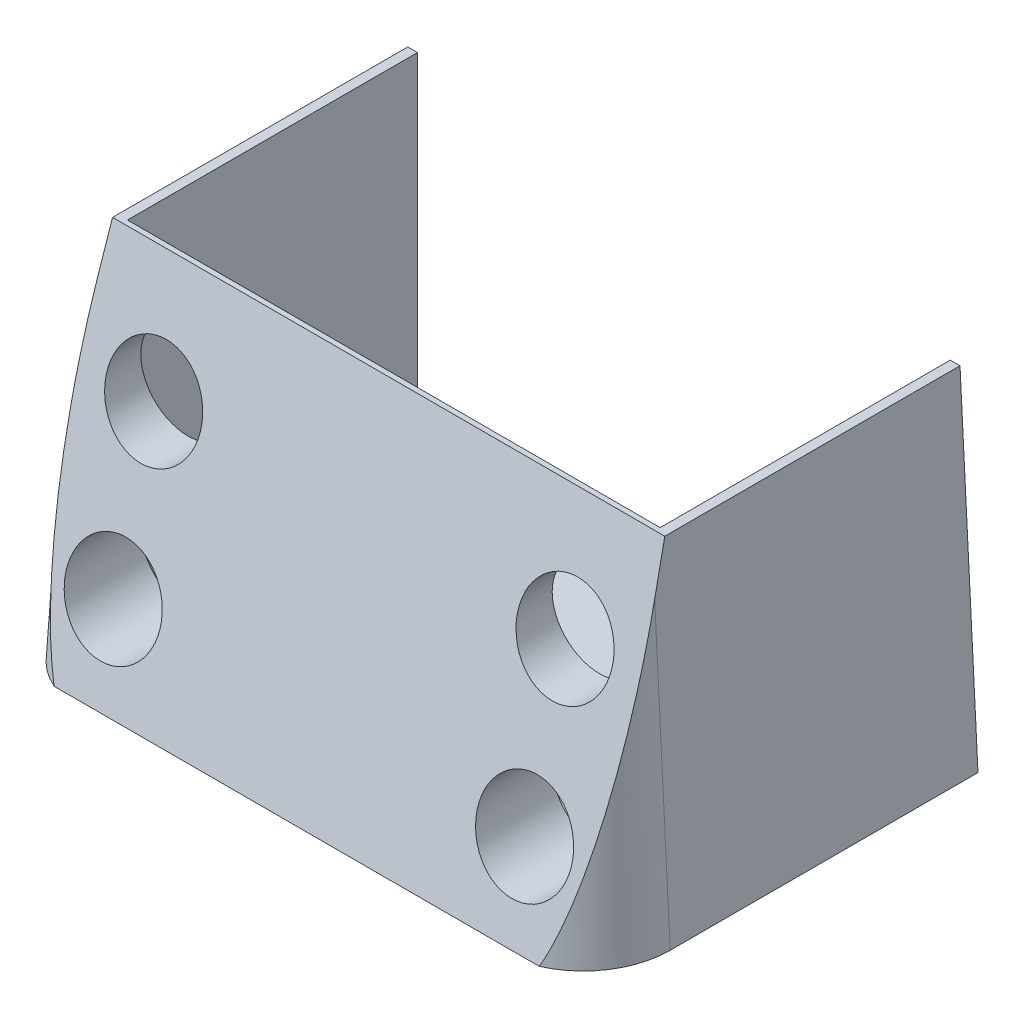
ISO-10303-21;
HEADER;
FILE_DESCRIPTION(('STEP AP214'),'2;1');
FILE_NAME('part.step','',(''),(''),'','','');
FILE_SCHEMA(('AUTOMOTIVE_DESIGN { 1 0 10303 214 1 1 1 1 }'));
ENDSEC;
DATA;
#1=APPLICATION_CONTEXT('core data for automotive mechanical design processes');
#2=APPLICATION_PROTOCOL_DEFINITION('international standard','automotive_design',2000,#1);
#3=PRODUCT_CONTEXT('',#1,'mechanical');
#4=PRODUCT('Part','Part','',(#3));
#5=PRODUCT_RELATED_PRODUCT_CATEGORY('part','',(#4));
#6=PRODUCT_DEFINITION_FORMATION('','',#4);
#7=PRODUCT_DEFINITION_CONTEXT('part definition',#1,'design');
#8=PRODUCT_DEFINITION('design','',#6,#7);
#9=PRODUCT_DEFINITION_SHAPE('','',#8);
#10=(LENGTH_UNIT() NAMED_UNIT(*) SI_UNIT(.MILLI.,.METRE.));
#11=(NAMED_UNIT(*) PLANE_ANGLE_UNIT() SI_UNIT($,.RADIAN.));
#12=(NAMED_UNIT(*) SI_UNIT($,.STERADIAN.) SOLID_ANGLE_UNIT());
#13=UNCERTAINTY_MEASURE_WITH_UNIT(LENGTH_MEASURE(1.E-05),#10,'distance_accuracy_value','');
#14=(GEOMETRIC_REPRESENTATION_CONTEXT(3) GLOBAL_UNCERTAINTY_ASSIGNED_CONTEXT((#13)) GLOBAL_UNIT_ASSIGNED_CONTEXT((#10,
#11,#12)) REPRESENTATION_CONTEXT('',''));
#15=CARTESIAN_POINT('',(0.,0.,0.));
#16=DIRECTION('',(0.,0.,1.));
#17=DIRECTION('',(1.,0.,0.));
#18=AXIS2_PLACEMENT_3D('',#15,#16,#17);
#19=CARTESIAN_POINT('',(34.75,45.5,50.));
#20=DIRECTION('',(0.,0.,-1.));
#21=DIRECTION('',(-1.,0.,0.));
#22=AXIS2_PLACEMENT_3D('',#19,#20,#21);
#23=CYLINDRICAL_SURFACE('',#22,8.);
#24=CARTESIAN_POINT('',(34.75,45.5,37.8272168333866));
#25=DIRECTION('',(0.,-0.258819045102516,-0.96592582628907));
#26=DIRECTION('',(0.,0.96592582628907,-0.258819045102516));
#27=AXIS2_PLACEMENT_3D('',#24,#25,#26);
#28=ELLIPSE('',#27,8.28220944328066,8.);
#29=CARTESIAN_POINT('',(34.75,53.5,35.6836232939376));
#30=VERTEX_POINT('',#29);
#31=EDGE_CURVE('E184',#30,#30,#28,.F.);
#32=ORIENTED_EDGE('',*,*,#31,.T.);
#33=EDGE_LOOP('',(#32));
#34=FACE_BOUND('',#33,.T.);
#35=CARTESIAN_POINT('',(34.75,45.5,32.));
#36=DIRECTION('',(0.,0.,-1.));
#37=DIRECTION('',(-1.,0.,0.));
#38=AXIS2_PLACEMENT_3D('',#35,#36,#37);
#39=CIRCLE('',#38,8.);
#40=CARTESIAN_POINT('',(26.75,45.5,32.));
#41=VERTEX_POINT('',#40);
#42=EDGE_CURVE('E179',#41,#41,#39,.T.);
#43=ORIENTED_EDGE('',*,*,#42,.T.);
#44=EDGE_LOOP('',(#43));
#45=FACE_BOUND('',#44,.T.);
#46=ADVANCED_FACE('F39',(#34,#45),#23,.F.);
#47=CARTESIAN_POINT('',(-34.75,20.,50.));
#48=DIRECTION('',(0.,0.,-1.));
#49=DIRECTION('',(-1.,0.,0.));
#50=AXIS2_PLACEMENT_3D('',#47,#48,#49);
#51=CYLINDRICAL_SURFACE('',#50,8.);
#52=CARTESIAN_POINT('',(-34.75,20.,44.6599212403801));
#53=DIRECTION('',(0.,-0.258819045102516,-0.96592582628907));
#54=DIRECTION('',(0.,0.96592582628907,-0.258819045102516));
#55=AXIS2_PLACEMENT_3D('',#52,#53,#54);
#56=ELLIPSE('',#55,8.28220944328065,8.);
#57=CARTESIAN_POINT('',(-34.75,28.,42.5163277009311));
#58=VERTEX_POINT('',#57);
#59=EDGE_CURVE('E215',#58,#58,#56,.F.);
#60=ORIENTED_EDGE('',*,*,#59,.T.);
#61=EDGE_LOOP('',(#60));
#62=FACE_BOUND('',#61,.T.);
#63=CARTESIAN_POINT('',(-34.75,20.,32.));
#64=DIRECTION('',(0.,0.,-1.));
#65=DIRECTION('',(-1.,0.,0.));
#66=AXIS2_PLACEMENT_3D('',#63,#64,#65);
#67=CIRCLE('',#66,8.);
#68=CARTESIAN_POINT('',(-42.75,20.,32.));
#69=VERTEX_POINT('',#68);
#70=EDGE_CURVE('E172',#69,#69,#67,.T.);
#71=ORIENTED_EDGE('',*,*,#70,.T.);
#72=EDGE_LOOP('',(#71));
#73=FACE_BOUND('',#72,.T.);
#74=ADVANCED_FACE('F239',(#62,#73),#51,.F.);
#75=CARTESIAN_POINT('',(34.75,20.,50.));
#76=DIRECTION('',(0.,0.,-1.));
#77=DIRECTION('',(-1.,0.,0.));
#78=AXIS2_PLACEMENT_3D('',#75,#76,#77);
#79=CYLINDRICAL_SURFACE('',#78,8.);
#80=CARTESIAN_POINT('',(34.75,20.,44.6599212403801));
#81=DIRECTION('',(0.,-0.258819045102516,-0.96592582628907));
#82=DIRECTION('',(0.,0.96592582628907,-0.258819045102516));
#83=AXIS2_PLACEMENT_3D('',#80,#81,#82);
#84=ELLIPSE('',#83,8.28220944328066,8.);
#85=CARTESIAN_POINT('',(34.75,28.,42.5163277009311));
#86=VERTEX_POINT('',#85);
#87=EDGE_CURVE('E217',#86,#86,#84,.F.);
#88=ORIENTED_EDGE('',*,*,#87,.T.);
#89=EDGE_LOOP('',(#88));
#90=FACE_BOUND('',#89,.T.);
#91=CARTESIAN_POINT('',(34.75,20.,32.));
#92=DIRECTION('',(0.,0.,-1.));
#93=DIRECTION('',(-1.,0.,0.));
#94=AXIS2_PLACEMENT_3D('',#91,#92,#93);
#95=CIRCLE('',#94,8.);
#96=CARTESIAN_POINT('',(26.75,20.,32.));
#97=VERTEX_POINT('',#96);
#98=EDGE_CURVE('E175',#97,#97,#95,.T.);
#99=ORIENTED_EDGE('',*,*,#98,.T.);
#100=EDGE_LOOP('',(#99));
#101=FACE_BOUND('',#100,.T.);
#102=ADVANCED_FACE('F291',(#90,#101),#79,.F.);
#103=CARTESIAN_POINT('',(-34.75,45.5,50.));
#104=DIRECTION('',(0.,0.,-1.));
#105=DIRECTION('',(-1.,0.,0.));
#106=AXIS2_PLACEMENT_3D('',#103,#104,#105);
#107=CYLINDRICAL_SURFACE('',#106,8.);
#108=CARTESIAN_POINT('',(-34.75,45.5,37.8272168333866));
#109=DIRECTION('',(0.,-0.258819045102516,-0.96592582628907));
#110=DIRECTION('',(0.,0.96592582628907,-0.258819045102516));
#111=AXIS2_PLACEMENT_3D('',#108,#109,#110);
#112=ELLIPSE('',#111,8.28220944328065,8.);
#113=CARTESIAN_POINT('',(-34.75,53.5,35.6836232939376));
#114=VERTEX_POINT('',#113);
#115=EDGE_CURVE('E44',#114,#114,#112,.F.);
#116=ORIENTED_EDGE('',*,*,#115,.T.);
#117=EDGE_LOOP('',(#116));
#118=FACE_BOUND('',#117,.T.);
#119=CARTESIAN_POINT('',(-34.75,45.5,32.));
#120=DIRECTION('',(0.,0.,-1.));
#121=DIRECTION('',(-1.,0.,0.));
#122=AXIS2_PLACEMENT_3D('',#119,#120,#121);
#123=CIRCLE('',#122,8.);
#124=CARTESIAN_POINT('',(-42.75,45.5,32.));
#125=VERTEX_POINT('',#124);
#126=EDGE_CURVE('E176',#125,#125,#123,.T.);
#127=ORIENTED_EDGE('',*,*,#126,.T.);
#128=EDGE_LOOP('',(#127));
#129=FACE_BOUND('',#128,.T.);
#130=ADVANCED_FACE('F224',(#118,#129),#107,.F.);
#131=CARTESIAN_POINT('',(-40.,25.,32.));
#132=DIRECTION('',(0.,0.,-1.));
#133=DIRECTION('',(-1.,0.,0.));
#134=AXIS2_PLACEMENT_3D('',#131,#132,#133);
#135=PLANE('',#134);
#136=ORIENTED_EDGE('',*,*,#126,.F.);
#137=EDGE_LOOP('',(#136));
#138=FACE_BOUND('',#137,.T.);
#139=ORIENTED_EDGE('',*,*,#98,.F.);
#140=EDGE_LOOP('',(#139));
#141=FACE_BOUND('',#140,.T.);
#142=ORIENTED_EDGE('',*,*,#70,.F.);
#143=EDGE_LOOP('',(#142));
#144=FACE_BOUND('',#143,.T.);
#145=ORIENTED_EDGE('',*,*,#42,.F.);
#146=EDGE_LOOP('',(#145));
#147=FACE_BOUND('',#146,.T.);
#148=DIRECTION('',(0.,-1.,0.));
#149=VECTOR('',#148,1.);
#150=CARTESIAN_POINT('',(45.,64.,32.));
#151=LINE('',#150,#149);
#152=CARTESIAN_POINT('',(45.,64.,32.));
#153=VERTEX_POINT('',#152);
#154=CARTESIAN_POINT('',(45.,9.99999999999999,32.));
#155=VERTEX_POINT('',#154);
#156=EDGE_CURVE('E195',#153,#155,#151,.T.);
#157=ORIENTED_EDGE('',*,*,#156,.T.);
#158=DIRECTION('',(1.,0.,0.));
#159=VECTOR('',#158,1.);
#160=CARTESIAN_POINT('',(-40.,10.,32.));
#161=LINE('',#160,#159);
#162=CARTESIAN_POINT('',(-45.,9.99999999999999,32.));
#163=VERTEX_POINT('',#162);
#164=EDGE_CURVE('E202',#163,#155,#161,.T.);
#165=ORIENTED_EDGE('',*,*,#164,.F.);
#166=DIRECTION('',(0.,-1.,0.));
#167=VECTOR('',#166,1.);
#168=CARTESIAN_POINT('',(-45.,64.,32.));
#169=LINE('',#168,#167);
#170=CARTESIAN_POINT('',(-45.,64.,32.));
#171=VERTEX_POINT('',#170);
#172=EDGE_CURVE('E192',#171,#163,#169,.T.);
#173=ORIENTED_EDGE('',*,*,#172,.F.);
#174=DIRECTION('',(1.,0.,0.));
#175=VECTOR('',#174,1.);
#176=CARTESIAN_POINT('',(45.,64.,32.));
#177=LINE('',#176,#175);
#178=EDGE_CURVE('E185',#171,#153,#177,.T.);
#179=ORIENTED_EDGE('',*,*,#178,.T.);
#180=EDGE_LOOP('',(#157,#165,#173,#179));
#181=FACE_BOUND('',#180,.T.);
#182=ADVANCED_FACE('F243',(#138,#141,#144,#147,#181),#135,.T.);
#183=CARTESIAN_POINT('',(-45.,166.42135623731,37.));
#184=DIRECTION('',(1.,0.,0.));
#185=DIRECTION('',(0.,0.,-1.));
#186=AXIS2_PLACEMENT_3D('',#183,#184,#185);
#187=PLANE('',#186);
#188=DIRECTION('',(0.,0.,1.));
#189=VECTOR('',#188,1.);
#190=CARTESIAN_POINT('',(-45.,10.,37.));
#191=LINE('',#190,#189);
#192=CARTESIAN_POINT('',(-45.,10.,-17.));
#193=VERTEX_POINT('',#192);
#194=EDGE_CURVE('E198',#193,#163,#191,.T.);
#195=ORIENTED_EDGE('',*,*,#194,.F.);
#196=DIRECTION('',(0.,-1.,0.));
#197=VECTOR('',#196,1.);
#198=CARTESIAN_POINT('',(-45.,64.,-17.));
#199=LINE('',#198,#197);
#200=CARTESIAN_POINT('',(-45.,64.,-17.));
#201=VERTEX_POINT('',#200);
#202=EDGE_CURVE('E157',#201,#193,#199,.T.);
#203=ORIENTED_EDGE('',*,*,#202,.F.);
#204=DIRECTION('',(0.,0.,1.));
#205=VECTOR('',#204,1.);
#206=CARTESIAN_POINT('',(-45.,64.,-35.));
#207=LINE('',#206,#205);
#208=EDGE_CURVE('E190',#201,#171,#207,.T.);
#209=ORIENTED_EDGE('',*,*,#208,.T.);
#210=ORIENTED_EDGE('',*,*,#172,.T.);
#211=EDGE_LOOP('',(#195,#203,#209,#210));
#212=FACE_BOUND('',#211,.T.);
#213=ADVANCED_FACE('F246',(#212),#187,.T.);
#214=CARTESIAN_POINT('',(-35.,64.,-35.));
#215=DIRECTION('',(0.,1.,0.));
#216=DIRECTION('',(0.,0.,1.));
#217=AXIS2_PLACEMENT_3D('',#214,#215,#216);
#218=PLANE('',#217);
#219=ORIENTED_EDGE('',*,*,#208,.F.);
#220=DIRECTION('',(1.,0.,0.));
#221=VECTOR('',#220,1.);
#222=CARTESIAN_POINT('',(-46.6459021258853,64.,-17.));
#223=LINE('',#222,#221);
#224=CARTESIAN_POINT('',(-46.6459021258853,64.,-17.));
#225=VERTEX_POINT('',#224);
#226=EDGE_CURVE('E154',#225,#201,#223,.T.);
#227=ORIENTED_EDGE('',*,*,#226,.F.);
#228=DIRECTION('',(0.,0.,1.));
#229=VECTOR('',#228,1.);
#230=CARTESIAN_POINT('',(-46.6459021258853,64.,35.));
#231=LINE('',#230,#229);
#232=CARTESIAN_POINT('',(-46.6459021258853,64.,32.8701567734109));
#233=VERTEX_POINT('',#232);
#234=EDGE_CURVE('E132',#225,#233,#231,.T.);
#235=ORIENTED_EDGE('',*,*,#234,.T.);
#236=DIRECTION('',(1.,0.,0.));
#237=VECTOR('',#236,1.);
#238=CARTESIAN_POINT('',(-35.,64.,32.8701567734109));
#239=LINE('',#238,#237);
#240=CARTESIAN_POINT('',(46.6459021258853,64.,32.8701567734109));
#241=VERTEX_POINT('',#240);
#242=EDGE_CURVE('E130',#233,#241,#239,.T.);
#243=ORIENTED_EDGE('',*,*,#242,.T.);
#244=DIRECTION('',(0.,0.,-1.));
#245=VECTOR('',#244,1.);
#246=CARTESIAN_POINT('',(46.6459021258853,64.,-35.));
#247=LINE('',#246,#245);
#248=CARTESIAN_POINT('',(46.6459021258853,64.,-17.));
#249=VERTEX_POINT('',#248);
#250=EDGE_CURVE('E123',#241,#249,#247,.T.);
#251=ORIENTED_EDGE('',*,*,#250,.T.);
#252=DIRECTION('',(1.,0.,0.));
#253=VECTOR('',#252,1.);
#254=CARTESIAN_POINT('',(45.,64.,-17.));
#255=LINE('',#254,#253);
#256=CARTESIAN_POINT('',(45.,64.,-17.));
#257=VERTEX_POINT('',#256);
#258=EDGE_CURVE('E128',#257,#249,#255,.T.);
#259=ORIENTED_EDGE('',*,*,#258,.F.);
#260=DIRECTION('',(0.,0.,-1.));
#261=VECTOR('',#260,1.);
#262=CARTESIAN_POINT('',(45.,64.,32.));
#263=LINE('',#262,#261);
#264=EDGE_CURVE('E187',#153,#257,#263,.T.);
#265=ORIENTED_EDGE('',*,*,#264,.F.);
#266=ORIENTED_EDGE('',*,*,#178,.F.);
#267=EDGE_LOOP('',(#219,#227,#235,#243,#251,#259,#265,#266));
#268=FACE_BOUND('',#267,.T.);
#269=ADVANCED_FACE('F125',(#268),#218,.T.);
#270=CARTESIAN_POINT('',(45.,166.42135623731,37.));
#271=DIRECTION('',(-1.,0.,0.));
#272=DIRECTION('',(0.,0.,1.));
#273=AXIS2_PLACEMENT_3D('',#270,#271,#272);
#274=PLANE('',#273);
#275=ORIENTED_EDGE('',*,*,#264,.T.);
#276=DIRECTION('',(0.,1.,0.));
#277=VECTOR('',#276,1.);
#278=CARTESIAN_POINT('',(45.,10.,-17.));
#279=LINE('',#278,#277);
#280=CARTESIAN_POINT('',(45.,10.,-17.));
#281=VERTEX_POINT('',#280);
#282=EDGE_CURVE('E147',#281,#257,#279,.T.);
#283=ORIENTED_EDGE('',*,*,#282,.F.);
#284=DIRECTION('',(0.,0.,-1.));
#285=VECTOR('',#284,1.);
#286=CARTESIAN_POINT('',(45.,10.,37.));
#287=LINE('',#286,#285);
#288=EDGE_CURVE('E200',#155,#281,#287,.T.);
#289=ORIENTED_EDGE('',*,*,#288,.F.);
#290=ORIENTED_EDGE('',*,*,#156,.F.);
#291=EDGE_LOOP('',(#275,#283,#289,#290));
#292=FACE_BOUND('',#291,.T.);
#293=ADVANCED_FACE('F255',(#292),#274,.T.);
#294=CARTESIAN_POINT('',(-35.,10.,-35.));
#295=DIRECTION('',(0.,-1.,0.));
#296=DIRECTION('',(0.,0.,-1.));
#297=AXIS2_PLACEMENT_3D('',#294,#295,#296);
#298=PLANE('',#297);
#299=ORIENTED_EDGE('',*,*,#288,.T.);
#300=DIRECTION('',(1.,0.,0.));
#301=VECTOR('',#300,1.);
#302=CARTESIAN_POINT('',(-45.,10.,-17.));
#303=LINE('',#302,#301);
#304=EDGE_CURVE('E160',#193,#281,#303,.T.);
#305=ORIENTED_EDGE('',*,*,#304,.F.);
#306=ORIENTED_EDGE('',*,*,#194,.T.);
#307=ORIENTED_EDGE('',*,*,#164,.T.);
#308=EDGE_LOOP('',(#299,#305,#306,#307));
#309=FACE_BOUND('',#308,.T.);
#310=ADVANCED_FACE('F258',(#309),#298,.F.);
#311=CARTESIAN_POINT('',(-46.6459021258853,64.,-35.));
#312=DIRECTION('',(-0.998629534754574,0.0523359562429415,0.));
#313=DIRECTION('',(0.,0.,-1.));
#314=AXIS2_PLACEMENT_3D('',#311,#312,#313);
#315=PLANE('',#314);
#316=DIRECTION('',(0.,0.,-1.));
#317=VECTOR('',#316,1.);
#318=CARTESIAN_POINT('',(-49.6855533243016,6.,-35.));
#319=LINE('',#318,#317);
#320=CARTESIAN_POINT('',(-49.6855533243016,5.99999999999999,35.));
#321=VERTEX_POINT('',#320);
#322=CARTESIAN_POINT('',(-49.6855533243016,5.99999999999999,-17.));
#323=VERTEX_POINT('',#322);
#324=EDGE_CURVE('E170',#321,#323,#319,.T.);
#325=ORIENTED_EDGE('',*,*,#324,.F.);
#326=DIRECTION('',(-0.0523359562429415,-0.998629534754574,0.));
#327=VECTOR('',#326,1.);
#328=CARTESIAN_POINT('',(-46.6459021258853,64.,35.));
#329=LINE('',#328,#327);
#330=CARTESIAN_POINT('',(-47.0624749571516,56.0513168662127,35.));
#331=VERTEX_POINT('',#330);
#332=EDGE_CURVE('E188',#331,#321,#329,.T.);
#333=ORIENTED_EDGE('',*,*,#332,.F.);
#334=DIRECTION('',(-0.0505572901604934,-0.964690564113556,0.258488057600147));
#335=VECTOR('',#334,1.);
#336=CARTESIAN_POINT('',(-45.7589439866283,80.924169491457,28.3353392256076));
#337=LINE('',#336,#335);
#338=EDGE_CURVE('E11',#331,#233,#337,.F.);
#339=ORIENTED_EDGE('',*,*,#338,.T.);
#340=ORIENTED_EDGE('',*,*,#234,.F.);
#341=DIRECTION('',(0.0523359562429415,0.998629534754574,0.));
#342=VECTOR('',#341,1.);
#343=CARTESIAN_POINT('',(-49.6855533243016,5.99999999999999,-17.));
#344=LINE('',#343,#342);
#345=EDGE_CURVE('E151',#323,#225,#344,.T.);
#346=ORIENTED_EDGE('',*,*,#345,.F.);
#347=EDGE_LOOP('',(#325,#333,#339,#340,#346));
#348=FACE_BOUND('',#347,.T.);
#349=ADVANCED_FACE('F266',(#348),#315,.T.);
#350=CARTESIAN_POINT('',(-35.,64.,35.));
#351=DIRECTION('',(0.,-1.,0.));
#352=DIRECTION('',(0.,0.,-1.));
#353=AXIS2_PLACEMENT_3D('',#350,#351,#352);
#354=CONICAL_SURFACE('',#353,11.6459021258853,0.0523598775598275);
#355=CARTESIAN_POINT('',(-35.,5.99999999999999,35.));
#356=DIRECTION('',(0.,1.,0.));
#357=DIRECTION('',(0.,0.,1.));
#358=AXIS2_PLACEMENT_3D('',#355,#356,#357);
#359=CIRCLE('',#358,14.6855533243015);
#360=CARTESIAN_POINT('',(-40.983721629215,5.99999999999999,48.4112099344157));
#361=VERTEX_POINT('',#360);
#362=EDGE_CURVE('E167',#361,#321,#359,.F.);
#363=ORIENTED_EDGE('',*,*,#362,.F.);
#364=CARTESIAN_POINT('',(-35.,46.8961286629139,37.4531252856288));
#365=DIRECTION('',(0.,-0.258819045102516,-0.96592582628907));
#366=DIRECTION('',(0.,-0.965925826289069,0.258819045102516));
#367=AXIS2_PLACEMENT_3D('',#364,#365,#366);
#368=ELLIPSE('',#367,48.4596411165837,12.3000371853413);
#369=EDGE_CURVE('E49',#361,#331,#368,.T.);
#370=ORIENTED_EDGE('',*,*,#369,.T.);
#371=ORIENTED_EDGE('',*,*,#332,.T.);
#372=EDGE_LOOP('',(#363,#370,#371));
#373=FACE_BOUND('',#372,.T.);
#374=ADVANCED_FACE('F230',(#373),#354,.T.);
#375=CARTESIAN_POINT('',(-35.,64.,32.8701567734109));
#376=DIRECTION('',(0.,-0.258819045102516,-0.96592582628907));
#377=DIRECTION('',(1.,0.,0.));
#378=AXIS2_PLACEMENT_3D('',#375,#376,#377);
#379=PLANE('',#378);
#380=DIRECTION('',(1.,0.,0.));
#381=VECTOR('',#380,1.);
#382=CARTESIAN_POINT('',(-35.,5.99999999999999,48.4112099344157));
#383=LINE('',#382,#381);
#384=CARTESIAN_POINT('',(40.983721629215,5.99999999999999,48.4112099344157));
#385=VERTEX_POINT('',#384);
#386=EDGE_CURVE('E163',#385,#361,#383,.F.);
#387=ORIENTED_EDGE('',*,*,#386,.F.);
#388=CARTESIAN_POINT('',(35.,46.896128662914,37.4531252856288));
#389=DIRECTION('',(0.,-0.258819045102516,-0.96592582628907));
#390=DIRECTION('',(0.,-0.965925826289069,0.258819045102516));
#391=AXIS2_PLACEMENT_3D('',#388,#389,#390);
#392=ELLIPSE('',#391,48.4596411165838,12.3000371853413);
#393=CARTESIAN_POINT('',(47.0624749571516,56.0513168662129,35.));
#394=VERTEX_POINT('',#393);
#395=EDGE_CURVE('E210',#394,#385,#392,.T.);
#396=ORIENTED_EDGE('',*,*,#395,.F.);
#397=DIRECTION('',(-0.0505572901604935,0.964690564113556,-0.258488057600147));
#398=VECTOR('',#397,1.);
#399=CARTESIAN_POINT('',(45.7589439866283,80.924169491457,28.3353392256076));
#400=LINE('',#399,#398);
#401=EDGE_CURVE('E208',#241,#394,#400,.F.);
#402=ORIENTED_EDGE('',*,*,#401,.F.);
#403=ORIENTED_EDGE('',*,*,#242,.F.);
#404=ORIENTED_EDGE('',*,*,#338,.F.);
#405=ORIENTED_EDGE('',*,*,#369,.F.);
#406=EDGE_LOOP('',(#387,#396,#402,#403,#404,#405));
#407=FACE_BOUND('',#406,.T.);
#408=ORIENTED_EDGE('',*,*,#115,.F.);
#409=EDGE_LOOP('',(#408));
#410=FACE_BOUND('',#409,.T.);
#411=ORIENTED_EDGE('',*,*,#87,.F.);
#412=EDGE_LOOP('',(#411));
#413=FACE_BOUND('',#412,.T.);
#414=ORIENTED_EDGE('',*,*,#59,.F.);
#415=EDGE_LOOP('',(#414));
#416=FACE_BOUND('',#415,.T.);
#417=ORIENTED_EDGE('',*,*,#31,.F.);
#418=EDGE_LOOP('',(#417));
#419=FACE_BOUND('',#418,.T.);
#420=ADVANCED_FACE('F42',(#407,#410,#413,#416,#419),#379,.F.);
#421=CARTESIAN_POINT('',(35.,64.,35.));
#422=DIRECTION('',(0.,-1.,0.));
#423=DIRECTION('',(0.,0.,-1.));
#424=AXIS2_PLACEMENT_3D('',#421,#422,#423);
#425=CONICAL_SURFACE('',#424,11.6459021258853,0.0523598775598275);
#426=CARTESIAN_POINT('',(35.,5.99999999999999,35.));
#427=DIRECTION('',(0.,1.,0.));
#428=DIRECTION('',(0.,0.,1.));
#429=AXIS2_PLACEMENT_3D('',#426,#427,#428);
#430=CIRCLE('',#429,14.6855533243016);
#431=CARTESIAN_POINT('',(49.6855533243016,5.99999999999999,35.));
#432=VERTEX_POINT('',#431);
#433=EDGE_CURVE('E165',#432,#385,#430,.F.);
#434=ORIENTED_EDGE('',*,*,#433,.F.);
#435=DIRECTION('',(-0.0523359562429415,0.998629534754574,0.));
#436=VECTOR('',#435,1.);
#437=CARTESIAN_POINT('',(50.,-4.19109191795997E-12,35.));
#438=LINE('',#437,#436);
#439=EDGE_CURVE('E64',#432,#394,#438,.T.);
#440=ORIENTED_EDGE('',*,*,#439,.T.);
#441=ORIENTED_EDGE('',*,*,#395,.T.);
#442=EDGE_LOOP('',(#434,#440,#441));
#443=FACE_BOUND('',#442,.T.);
#444=ADVANCED_FACE('F229',(#443),#425,.T.);
#445=CARTESIAN_POINT('',(46.6459021258853,64.,-35.));
#446=DIRECTION('',(0.998629534754574,0.0523359562429415,0.));
#447=DIRECTION('',(0.,0.,1.));
#448=AXIS2_PLACEMENT_3D('',#445,#446,#447);
#449=PLANE('',#448);
#450=DIRECTION('',(0.,0.,1.));
#451=VECTOR('',#450,1.);
#452=CARTESIAN_POINT('',(49.6855533243016,6.,-35.));
#453=LINE('',#452,#451);
#454=CARTESIAN_POINT('',(49.6855533243016,5.99999999999999,-17.));
#455=VERTEX_POINT('',#454);
#456=EDGE_CURVE('E137',#455,#432,#453,.T.);
#457=ORIENTED_EDGE('',*,*,#456,.F.);
#458=DIRECTION('',(0.0523359562429415,-0.998629534754574,0.));
#459=VECTOR('',#458,1.);
#460=CARTESIAN_POINT('',(46.6459021258853,64.,-17.));
#461=LINE('',#460,#459);
#462=EDGE_CURVE('E135',#249,#455,#461,.T.);
#463=ORIENTED_EDGE('',*,*,#462,.F.);
#464=ORIENTED_EDGE('',*,*,#250,.F.);
#465=ORIENTED_EDGE('',*,*,#401,.T.);
#466=ORIENTED_EDGE('',*,*,#439,.F.);
#467=EDGE_LOOP('',(#457,#463,#464,#465,#466));
#468=FACE_BOUND('',#467,.T.);
#469=ADVANCED_FACE('F136',(#468),#449,.T.);
#470=CARTESIAN_POINT('',(-50.,6.,-40.));
#471=DIRECTION('',(0.,1.,0.));
#472=DIRECTION('',(0.,0.,1.));
#473=AXIS2_PLACEMENT_3D('',#470,#471,#472);
#474=PLANE('',#473);
#475=ORIENTED_EDGE('',*,*,#324,.T.);
#476=DIRECTION('',(-1.,0.,0.));
#477=VECTOR('',#476,1.);
#478=CARTESIAN_POINT('',(49.6855533243016,5.99999999999999,-17.));
#479=LINE('',#478,#477);
#480=EDGE_CURVE('E141',#455,#323,#479,.T.);
#481=ORIENTED_EDGE('',*,*,#480,.F.);
#482=ORIENTED_EDGE('',*,*,#456,.T.);
#483=ORIENTED_EDGE('',*,*,#433,.T.);
#484=ORIENTED_EDGE('',*,*,#386,.T.);
#485=ORIENTED_EDGE('',*,*,#362,.T.);
#486=EDGE_LOOP('',(#475,#481,#482,#483,#484,#485));
#487=FACE_BOUND('',#486,.T.);
#488=ADVANCED_FACE('F270',(#487),#474,.F.);
#489=CARTESIAN_POINT('',(0.,0.,-17.));
#490=DIRECTION('',(0.,0.,-1.));
#491=DIRECTION('',(-1.,0.,0.));
#492=AXIS2_PLACEMENT_3D('',#489,#490,#491);
#493=PLANE('',#492);
#494=ORIENTED_EDGE('',*,*,#258,.T.);
#495=ORIENTED_EDGE('',*,*,#462,.T.);
#496=ORIENTED_EDGE('',*,*,#480,.T.);
#497=ORIENTED_EDGE('',*,*,#345,.T.);
#498=ORIENTED_EDGE('',*,*,#226,.T.);
#499=ORIENTED_EDGE('',*,*,#202,.T.);
#500=ORIENTED_EDGE('',*,*,#304,.T.);
#501=ORIENTED_EDGE('',*,*,#282,.T.);
#502=EDGE_LOOP('',(#494,#495,#496,#497,#498,#499,#500,#501));
#503=FACE_BOUND('',#502,.T.);
#504=ADVANCED_FACE('F144',(#503),#493,.T.);
#505=CLOSED_SHELL('',(#46,#74,#102,#130,#182,#213,#269,#293,#310,#349,#374,#420,#444,#469,#488,#504));
#506=MANIFOLD_SOLID_BREP('B2',#505);
#507=ADVANCED_BREP_SHAPE_REPRESENTATION('',(#18,#506),#14);
#508=SHAPE_DEFINITION_REPRESENTATION(#9,#507);
ENDSEC;
END-ISO-10303-21;
